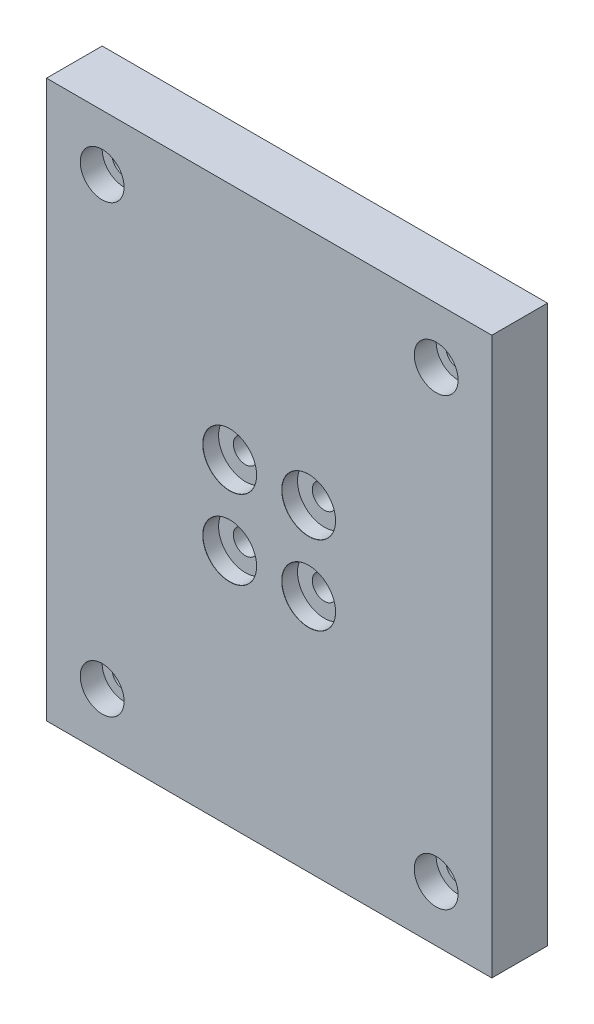
ISO-10303-21;
HEADER;
FILE_DESCRIPTION(('STEP AP214'),'2;1');
FILE_NAME('part.step','',(''),(''),'','','');
FILE_SCHEMA(('AUTOMOTIVE_DESIGN { 1 0 10303 214 1 1 1 1 }'));
ENDSEC;
DATA;
#1=APPLICATION_CONTEXT('core data for automotive mechanical design processes');
#2=APPLICATION_PROTOCOL_DEFINITION('international standard','automotive_design',2000,#1);
#3=PRODUCT_CONTEXT('',#1,'mechanical');
#4=PRODUCT('Part','Part','',(#3));
#5=PRODUCT_RELATED_PRODUCT_CATEGORY('part','',(#4));
#6=PRODUCT_DEFINITION_FORMATION('','',#4);
#7=PRODUCT_DEFINITION_CONTEXT('part definition',#1,'design');
#8=PRODUCT_DEFINITION('design','',#6,#7);
#9=PRODUCT_DEFINITION_SHAPE('','',#8);
#10=(LENGTH_UNIT() NAMED_UNIT(*) SI_UNIT(.MILLI.,.METRE.));
#11=(NAMED_UNIT(*) PLANE_ANGLE_UNIT() SI_UNIT($,.RADIAN.));
#12=(NAMED_UNIT(*) SI_UNIT($,.STERADIAN.) SOLID_ANGLE_UNIT());
#13=UNCERTAINTY_MEASURE_WITH_UNIT(LENGTH_MEASURE(1.E-05),#10,'distance_accuracy_value','');
#14=(GEOMETRIC_REPRESENTATION_CONTEXT(3) GLOBAL_UNCERTAINTY_ASSIGNED_CONTEXT((#13)) GLOBAL_UNIT_ASSIGNED_CONTEXT((#10,
#11,#12)) REPRESENTATION_CONTEXT('',''));
#15=CARTESIAN_POINT('',(0.,0.,0.));
#16=DIRECTION('',(0.,0.,1.));
#17=DIRECTION('',(1.,0.,0.));
#18=AXIS2_PLACEMENT_3D('',#15,#16,#17);
#19=CARTESIAN_POINT('',(0.,0.,12.7));
#20=DIRECTION('',(0.,0.,-1.));
#21=DIRECTION('',(-1.,0.,0.));
#22=AXIS2_PLACEMENT_3D('',#19,#20,#21);
#23=PLANE('',#22);
#24=CARTESIAN_POINT('',(12.7,114.3,12.7));
#25=DIRECTION('',(0.,0.,1.));
#26=DIRECTION('',(1.,0.,0.));
#27=AXIS2_PLACEMENT_3D('',#24,#25,#26);
#28=CIRCLE('',#27,5.);
#29=CARTESIAN_POINT('',(17.7,114.3,12.7));
#30=VERTEX_POINT('',#29);
#31=EDGE_CURVE('E225',#30,#30,#28,.T.);
#32=ORIENTED_EDGE('',*,*,#31,.F.);
#33=EDGE_LOOP('',(#32));
#34=FACE_BOUND('',#33,.T.);
#35=CARTESIAN_POINT('',(88.9,114.3,12.7));
#36=DIRECTION('',(0.,0.,1.));
#37=DIRECTION('',(1.,0.,0.));
#38=AXIS2_PLACEMENT_3D('',#35,#36,#37);
#39=CIRCLE('',#38,5.);
#40=CARTESIAN_POINT('',(93.9,114.3,12.7));
#41=VERTEX_POINT('',#40);
#42=EDGE_CURVE('E213',#41,#41,#39,.T.);
#43=ORIENTED_EDGE('',*,*,#42,.F.);
#44=EDGE_LOOP('',(#43));
#45=FACE_BOUND('',#44,.T.);
#46=CARTESIAN_POINT('',(88.9,12.7,12.7));
#47=DIRECTION('',(0.,0.,1.));
#48=DIRECTION('',(1.,0.,0.));
#49=AXIS2_PLACEMENT_3D('',#46,#47,#48);
#50=CIRCLE('',#49,5.);
#51=CARTESIAN_POINT('',(93.9,12.7,12.7));
#52=VERTEX_POINT('',#51);
#53=EDGE_CURVE('E201',#52,#52,#50,.T.);
#54=ORIENTED_EDGE('',*,*,#53,.F.);
#55=EDGE_LOOP('',(#54));
#56=FACE_BOUND('',#55,.T.);
#57=CARTESIAN_POINT('',(12.7,12.7,12.7));
#58=DIRECTION('',(0.,0.,1.));
#59=DIRECTION('',(1.,0.,0.));
#60=AXIS2_PLACEMENT_3D('',#57,#58,#59);
#61=CIRCLE('',#60,5.);
#62=CARTESIAN_POINT('',(17.7,12.7,12.7));
#63=VERTEX_POINT('',#62);
#64=EDGE_CURVE('E189',#63,#63,#61,.T.);
#65=ORIENTED_EDGE('',*,*,#64,.F.);
#66=EDGE_LOOP('',(#65));
#67=FACE_BOUND('',#66,.T.);
#68=CARTESIAN_POINT('',(41.7957,72.5,12.7));
#69=DIRECTION('',(0.,0.,1.));
#70=DIRECTION('',(1.,0.,0.));
#71=AXIS2_PLACEMENT_3D('',#68,#69,#70);
#72=CIRCLE('',#71,6.145);
#73=CARTESIAN_POINT('',(47.9407,72.5,12.7));
#74=VERTEX_POINT('',#73);
#75=EDGE_CURVE('E177',#74,#74,#72,.T.);
#76=ORIENTED_EDGE('',*,*,#75,.F.);
#77=EDGE_LOOP('',(#76));
#78=FACE_BOUND('',#77,.T.);
#79=CARTESIAN_POINT('',(41.7957,54.5,12.7));
#80=DIRECTION('',(0.,0.,1.));
#81=DIRECTION('',(1.,0.,0.));
#82=AXIS2_PLACEMENT_3D('',#79,#80,#81);
#83=CIRCLE('',#82,6.145);
#84=CARTESIAN_POINT('',(47.9407,54.5,12.7));
#85=VERTEX_POINT('',#84);
#86=EDGE_CURVE('E132',#85,#85,#83,.T.);
#87=ORIENTED_EDGE('',*,*,#86,.F.);
#88=EDGE_LOOP('',(#87));
#89=FACE_BOUND('',#88,.T.);
#90=DIRECTION('',(0.,-1.,0.));
#91=VECTOR('',#90,1.);
#92=CARTESIAN_POINT('',(0.,0.,12.7));
#93=LINE('',#92,#91);
#94=CARTESIAN_POINT('',(0.,127.,12.7));
#95=VERTEX_POINT('',#94);
#96=CARTESIAN_POINT('',(0.,0.,12.7));
#97=VERTEX_POINT('',#96);
#98=EDGE_CURVE('E95',#95,#97,#93,.T.);
#99=ORIENTED_EDGE('',*,*,#98,.T.);
#100=DIRECTION('',(1.,0.,0.));
#101=VECTOR('',#100,1.);
#102=CARTESIAN_POINT('',(0.,0.,12.7));
#103=LINE('',#102,#101);
#104=CARTESIAN_POINT('',(101.6,0.,12.7));
#105=VERTEX_POINT('',#104);
#106=EDGE_CURVE('E90',#97,#105,#103,.T.);
#107=ORIENTED_EDGE('',*,*,#106,.T.);
#108=DIRECTION('',(0.,1.,0.));
#109=VECTOR('',#108,1.);
#110=CARTESIAN_POINT('',(101.6,0.,12.7));
#111=LINE('',#110,#109);
#112=CARTESIAN_POINT('',(101.6,127.,12.7));
#113=VERTEX_POINT('',#112);
#114=EDGE_CURVE('E93',#105,#113,#111,.T.);
#115=ORIENTED_EDGE('',*,*,#114,.T.);
#116=DIRECTION('',(-1.,0.,0.));
#117=VECTOR('',#116,1.);
#118=CARTESIAN_POINT('',(0.,127.,12.7));
#119=LINE('',#118,#117);
#120=EDGE_CURVE('E60',#113,#95,#119,.T.);
#121=ORIENTED_EDGE('',*,*,#120,.T.);
#122=EDGE_LOOP('',(#99,#107,#115,#121));
#123=FACE_BOUND('',#122,.T.);
#124=CARTESIAN_POINT('',(59.8043,54.5,12.7));
#125=DIRECTION('',(0.,0.,1.));
#126=DIRECTION('',(1.,0.,0.));
#127=AXIS2_PLACEMENT_3D('',#124,#125,#126);
#128=CIRCLE('',#127,6.14499999999999);
#129=CARTESIAN_POINT('',(65.9493,54.5,12.7));
#130=VERTEX_POINT('',#129);
#131=EDGE_CURVE('E147',#130,#130,#128,.T.);
#132=ORIENTED_EDGE('',*,*,#131,.F.);
#133=EDGE_LOOP('',(#132));
#134=FACE_BOUND('',#133,.T.);
#135=CARTESIAN_POINT('',(59.8043,72.5,12.7));
#136=DIRECTION('',(0.,0.,1.));
#137=DIRECTION('',(1.,0.,0.));
#138=AXIS2_PLACEMENT_3D('',#135,#136,#137);
#139=CIRCLE('',#138,6.14499999999999);
#140=CARTESIAN_POINT('',(65.9493,72.5,12.7));
#141=VERTEX_POINT('',#140);
#142=EDGE_CURVE('E162',#141,#141,#139,.T.);
#143=ORIENTED_EDGE('',*,*,#142,.F.);
#144=EDGE_LOOP('',(#143));
#145=FACE_BOUND('',#144,.T.);
#146=ADVANCED_FACE('F43',(#34,#45,#56,#67,#78,#89,#123,#134,#145),#23,.F.);
#147=CARTESIAN_POINT('',(0.,0.,12.7));
#148=DIRECTION('',(1.,0.,0.));
#149=DIRECTION('',(0.,0.,-1.));
#150=AXIS2_PLACEMENT_3D('',#147,#148,#149);
#151=PLANE('',#150);
#152=DIRECTION('',(0.,-1.,0.));
#153=VECTOR('',#152,1.);
#154=CARTESIAN_POINT('',(0.,0.,0.));
#155=LINE('',#154,#153);
#156=CARTESIAN_POINT('',(0.,127.,0.));
#157=VERTEX_POINT('',#156);
#158=CARTESIAN_POINT('',(0.,0.,0.));
#159=VERTEX_POINT('',#158);
#160=EDGE_CURVE('E107',#157,#159,#155,.T.);
#161=ORIENTED_EDGE('',*,*,#160,.T.);
#162=DIRECTION('',(0.,0.,-1.));
#163=VECTOR('',#162,1.);
#164=CARTESIAN_POINT('',(0.,0.,12.7));
#165=LINE('',#164,#163);
#166=EDGE_CURVE('E11',#97,#159,#165,.T.);
#167=ORIENTED_EDGE('',*,*,#166,.F.);
#168=ORIENTED_EDGE('',*,*,#98,.F.);
#169=DIRECTION('',(0.,0.,-1.));
#170=VECTOR('',#169,1.);
#171=CARTESIAN_POINT('',(0.,127.,12.7));
#172=LINE('',#171,#170);
#173=EDGE_CURVE('E103',#95,#157,#172,.T.);
#174=ORIENTED_EDGE('',*,*,#173,.T.);
#175=EDGE_LOOP('',(#161,#167,#168,#174));
#176=FACE_BOUND('',#175,.T.);
#177=ADVANCED_FACE('F45',(#176),#151,.F.);
#178=CARTESIAN_POINT('',(0.,0.,12.7));
#179=DIRECTION('',(0.,1.,0.));
#180=DIRECTION('',(0.,0.,1.));
#181=AXIS2_PLACEMENT_3D('',#178,#179,#180);
#182=PLANE('',#181);
#183=DIRECTION('',(1.,0.,0.));
#184=VECTOR('',#183,1.);
#185=CARTESIAN_POINT('',(0.,0.,0.));
#186=LINE('',#185,#184);
#187=CARTESIAN_POINT('',(101.6,0.,0.));
#188=VERTEX_POINT('',#187);
#189=EDGE_CURVE('E99',#159,#188,#186,.T.);
#190=ORIENTED_EDGE('',*,*,#189,.T.);
#191=DIRECTION('',(0.,0.,-1.));
#192=VECTOR('',#191,1.);
#193=CARTESIAN_POINT('',(101.6,0.,12.7));
#194=LINE('',#193,#192);
#195=EDGE_CURVE('E52',#105,#188,#194,.T.);
#196=ORIENTED_EDGE('',*,*,#195,.F.);
#197=ORIENTED_EDGE('',*,*,#106,.F.);
#198=ORIENTED_EDGE('',*,*,#166,.T.);
#199=EDGE_LOOP('',(#190,#196,#197,#198));
#200=FACE_BOUND('',#199,.T.);
#201=ADVANCED_FACE('F98',(#200),#182,.F.);
#202=CARTESIAN_POINT('',(101.6,0.,12.7));
#203=DIRECTION('',(-1.,0.,0.));
#204=DIRECTION('',(0.,0.,1.));
#205=AXIS2_PLACEMENT_3D('',#202,#203,#204);
#206=PLANE('',#205);
#207=DIRECTION('',(0.,1.,0.));
#208=VECTOR('',#207,1.);
#209=CARTESIAN_POINT('',(101.6,0.,0.));
#210=LINE('',#209,#208);
#211=CARTESIAN_POINT('',(101.6,127.,0.));
#212=VERTEX_POINT('',#211);
#213=EDGE_CURVE('E77',#188,#212,#210,.T.);
#214=ORIENTED_EDGE('',*,*,#213,.T.);
#215=DIRECTION('',(0.,0.,-1.));
#216=VECTOR('',#215,1.);
#217=CARTESIAN_POINT('',(101.6,127.,12.7));
#218=LINE('',#217,#216);
#219=EDGE_CURVE('E100',#113,#212,#218,.T.);
#220=ORIENTED_EDGE('',*,*,#219,.F.);
#221=ORIENTED_EDGE('',*,*,#114,.F.);
#222=ORIENTED_EDGE('',*,*,#195,.T.);
#223=EDGE_LOOP('',(#214,#220,#221,#222));
#224=FACE_BOUND('',#223,.T.);
#225=ADVANCED_FACE('F101',(#224),#206,.F.);
#226=CARTESIAN_POINT('',(0.,127.,12.7));
#227=DIRECTION('',(0.,-1.,0.));
#228=DIRECTION('',(0.,0.,-1.));
#229=AXIS2_PLACEMENT_3D('',#226,#227,#228);
#230=PLANE('',#229);
#231=DIRECTION('',(-1.,0.,0.));
#232=VECTOR('',#231,1.);
#233=CARTESIAN_POINT('',(0.,127.,0.));
#234=LINE('',#233,#232);
#235=EDGE_CURVE('E83',#212,#157,#234,.T.);
#236=ORIENTED_EDGE('',*,*,#235,.T.);
#237=ORIENTED_EDGE('',*,*,#173,.F.);
#238=ORIENTED_EDGE('',*,*,#120,.F.);
#239=ORIENTED_EDGE('',*,*,#219,.T.);
#240=EDGE_LOOP('',(#236,#237,#238,#239));
#241=FACE_BOUND('',#240,.T.);
#242=ADVANCED_FACE('F115',(#241),#230,.F.);
#243=CARTESIAN_POINT('',(0.,0.,0.));
#244=DIRECTION('',(0.,0.,-1.));
#245=DIRECTION('',(-1.,0.,0.));
#246=AXIS2_PLACEMENT_3D('',#243,#244,#245);
#247=PLANE('',#246);
#248=CARTESIAN_POINT('',(12.7,114.3,0.));
#249=DIRECTION('',(0.,0.,1.));
#250=DIRECTION('',(1.,0.,0.));
#251=AXIS2_PLACEMENT_3D('',#248,#249,#250);
#252=CIRCLE('',#251,2.75);
#253=CARTESIAN_POINT('',(15.45,114.3,0.));
#254=VERTEX_POINT('',#253);
#255=EDGE_CURVE('E216',#254,#254,#252,.T.);
#256=ORIENTED_EDGE('',*,*,#255,.T.);
#257=EDGE_LOOP('',(#256));
#258=FACE_BOUND('',#257,.T.);
#259=CARTESIAN_POINT('',(88.9,114.3,0.));
#260=DIRECTION('',(0.,0.,1.));
#261=DIRECTION('',(1.,0.,0.));
#262=AXIS2_PLACEMENT_3D('',#259,#260,#261);
#263=CIRCLE('',#262,2.75);
#264=CARTESIAN_POINT('',(91.65,114.3,0.));
#265=VERTEX_POINT('',#264);
#266=EDGE_CURVE('E204',#265,#265,#263,.T.);
#267=ORIENTED_EDGE('',*,*,#266,.T.);
#268=EDGE_LOOP('',(#267));
#269=FACE_BOUND('',#268,.T.);
#270=CARTESIAN_POINT('',(88.9,12.7,0.));
#271=DIRECTION('',(0.,0.,1.));
#272=DIRECTION('',(1.,0.,0.));
#273=AXIS2_PLACEMENT_3D('',#270,#271,#272);
#274=CIRCLE('',#273,2.75);
#275=CARTESIAN_POINT('',(91.65,12.7,0.));
#276=VERTEX_POINT('',#275);
#277=EDGE_CURVE('E192',#276,#276,#274,.T.);
#278=ORIENTED_EDGE('',*,*,#277,.T.);
#279=EDGE_LOOP('',(#278));
#280=FACE_BOUND('',#279,.T.);
#281=CARTESIAN_POINT('',(12.7,12.7,0.));
#282=DIRECTION('',(0.,0.,1.));
#283=DIRECTION('',(1.,0.,0.));
#284=AXIS2_PLACEMENT_3D('',#281,#282,#283);
#285=CIRCLE('',#284,2.75);
#286=CARTESIAN_POINT('',(15.45,12.7,0.));
#287=VERTEX_POINT('',#286);
#288=EDGE_CURVE('E180',#287,#287,#285,.T.);
#289=ORIENTED_EDGE('',*,*,#288,.T.);
#290=EDGE_LOOP('',(#289));
#291=FACE_BOUND('',#290,.T.);
#292=CARTESIAN_POINT('',(41.7957,72.5,0.));
#293=DIRECTION('',(0.,0.,-1.));
#294=DIRECTION('',(-1.,0.,0.));
#295=AXIS2_PLACEMENT_3D('',#292,#293,#294);
#296=CIRCLE('',#295,2.75);
#297=CARTESIAN_POINT('',(39.0457,72.5,0.));
#298=VERTEX_POINT('',#297);
#299=EDGE_CURVE('E165',#298,#298,#296,.T.);
#300=ORIENTED_EDGE('',*,*,#299,.F.);
#301=EDGE_LOOP('',(#300));
#302=FACE_BOUND('',#301,.T.);
#303=CARTESIAN_POINT('',(59.8043,72.5,0.));
#304=DIRECTION('',(0.,0.,-1.));
#305=DIRECTION('',(-1.,0.,0.));
#306=AXIS2_PLACEMENT_3D('',#303,#304,#305);
#307=CIRCLE('',#306,2.75);
#308=CARTESIAN_POINT('',(57.0543,72.5,0.));
#309=VERTEX_POINT('',#308);
#310=EDGE_CURVE('E150',#309,#309,#307,.T.);
#311=ORIENTED_EDGE('',*,*,#310,.F.);
#312=EDGE_LOOP('',(#311));
#313=FACE_BOUND('',#312,.T.);
#314=CARTESIAN_POINT('',(59.8043,54.5,0.));
#315=DIRECTION('',(0.,0.,-1.));
#316=DIRECTION('',(-1.,0.,0.));
#317=AXIS2_PLACEMENT_3D('',#314,#315,#316);
#318=CIRCLE('',#317,2.75);
#319=CARTESIAN_POINT('',(57.0543,54.5,0.));
#320=VERTEX_POINT('',#319);
#321=EDGE_CURVE('E135',#320,#320,#318,.T.);
#322=ORIENTED_EDGE('',*,*,#321,.F.);
#323=EDGE_LOOP('',(#322));
#324=FACE_BOUND('',#323,.T.);
#325=CARTESIAN_POINT('',(41.7957,54.5,0.));
#326=DIRECTION('',(0.,0.,-1.));
#327=DIRECTION('',(-1.,0.,0.));
#328=AXIS2_PLACEMENT_3D('',#325,#326,#327);
#329=CIRCLE('',#328,2.75);
#330=CARTESIAN_POINT('',(39.0457,54.5,0.));
#331=VERTEX_POINT('',#330);
#332=EDGE_CURVE('E110',#331,#331,#329,.T.);
#333=ORIENTED_EDGE('',*,*,#332,.F.);
#334=EDGE_LOOP('',(#333));
#335=FACE_BOUND('',#334,.T.);
#336=ORIENTED_EDGE('',*,*,#160,.F.);
#337=ORIENTED_EDGE('',*,*,#235,.F.);
#338=ORIENTED_EDGE('',*,*,#213,.F.);
#339=ORIENTED_EDGE('',*,*,#189,.F.);
#340=EDGE_LOOP('',(#336,#337,#338,#339));
#341=FACE_BOUND('',#340,.T.);
#342=ADVANCED_FACE('F118',(#258,#269,#280,#291,#302,#313,#324,#335,#341),#247,.T.);
#343=CARTESIAN_POINT('',(41.7957,54.5,12.7));
#344=DIRECTION('',(0.,0.,1.));
#345=DIRECTION('',(1.,0.,0.));
#346=AXIS2_PLACEMENT_3D('',#343,#344,#345);
#347=CYLINDRICAL_SURFACE('',#346,2.75);
#348=CARTESIAN_POINT('',(41.7957,54.5,9.12));
#349=DIRECTION('',(0.,0.,1.));
#350=DIRECTION('',(1.,0.,0.));
#351=AXIS2_PLACEMENT_3D('',#348,#349,#350);
#352=CIRCLE('',#351,2.75);
#353=CARTESIAN_POINT('',(44.5457,54.5,9.12));
#354=VERTEX_POINT('',#353);
#355=EDGE_CURVE('E123',#354,#354,#352,.T.);
#356=ORIENTED_EDGE('',*,*,#355,.T.);
#357=EDGE_LOOP('',(#356));
#358=FACE_BOUND('',#357,.T.);
#359=ORIENTED_EDGE('',*,*,#332,.T.);
#360=EDGE_LOOP('',(#359));
#361=FACE_BOUND('',#360,.T.);
#362=ADVANCED_FACE('F265',(#358,#361),#347,.F.);
#363=CARTESIAN_POINT('',(47.9157,54.5,9.12));
#364=DIRECTION('',(0.,0.,-1.));
#365=DIRECTION('',(-1.,0.,0.));
#366=AXIS2_PLACEMENT_3D('',#363,#364,#365);
#367=PLANE('',#366);
#368=ORIENTED_EDGE('',*,*,#355,.F.);
#369=EDGE_LOOP('',(#368));
#370=FACE_BOUND('',#369,.T.);
#371=CARTESIAN_POINT('',(41.7957,54.5,9.12));
#372=DIRECTION('',(0.,0.,1.));
#373=DIRECTION('',(1.,0.,0.));
#374=AXIS2_PLACEMENT_3D('',#371,#372,#373);
#375=CIRCLE('',#374,6.12);
#376=CARTESIAN_POINT('',(47.9157,54.5,9.12));
#377=VERTEX_POINT('',#376);
#378=EDGE_CURVE('E126',#377,#377,#375,.T.);
#379=ORIENTED_EDGE('',*,*,#378,.T.);
#380=EDGE_LOOP('',(#379));
#381=FACE_BOUND('',#380,.T.);
#382=ADVANCED_FACE('F257',(#370,#381),#367,.F.);
#383=CARTESIAN_POINT('',(41.7957,54.5,12.7));
#384=DIRECTION('',(0.,0.,1.));
#385=DIRECTION('',(1.,0.,0.));
#386=AXIS2_PLACEMENT_3D('',#383,#384,#385);
#387=CYLINDRICAL_SURFACE('',#386,6.12);
#388=ORIENTED_EDGE('',*,*,#378,.F.);
#389=EDGE_LOOP('',(#388));
#390=FACE_BOUND('',#389,.T.);
#391=CARTESIAN_POINT('',(41.7957,54.5,12.675));
#392=DIRECTION('',(0.,0.,1.));
#393=DIRECTION('',(1.,0.,0.));
#394=AXIS2_PLACEMENT_3D('',#391,#392,#393);
#395=CIRCLE('',#394,6.12);
#396=CARTESIAN_POINT('',(47.9157,54.5,12.675));
#397=VERTEX_POINT('',#396);
#398=EDGE_CURVE('E129',#397,#397,#395,.T.);
#399=ORIENTED_EDGE('',*,*,#398,.T.);
#400=EDGE_LOOP('',(#399));
#401=FACE_BOUND('',#400,.T.);
#402=ADVANCED_FACE('F247',(#390,#401),#387,.F.);
#403=CARTESIAN_POINT('',(41.7957,54.5,12.7));
#404=DIRECTION('',(0.,0.,1.));
#405=DIRECTION('',(1.,0.,0.));
#406=AXIS2_PLACEMENT_3D('',#403,#404,#405);
#407=CONICAL_SURFACE('',#406,6.145,0.78539816339731);
#408=ORIENTED_EDGE('',*,*,#398,.F.);
#409=EDGE_LOOP('',(#408));
#410=FACE_BOUND('',#409,.T.);
#411=ORIENTED_EDGE('',*,*,#86,.T.);
#412=EDGE_LOOP('',(#411));
#413=FACE_BOUND('',#412,.T.);
#414=ADVANCED_FACE('F244',(#410,#413),#407,.F.);
#415=CARTESIAN_POINT('',(59.8043,54.5,12.7));
#416=DIRECTION('',(0.,0.,1.));
#417=DIRECTION('',(1.,0.,0.));
#418=AXIS2_PLACEMENT_3D('',#415,#416,#417);
#419=CYLINDRICAL_SURFACE('',#418,2.75);
#420=CARTESIAN_POINT('',(59.8043,54.5,9.12));
#421=DIRECTION('',(0.,0.,1.));
#422=DIRECTION('',(1.,0.,0.));
#423=AXIS2_PLACEMENT_3D('',#420,#421,#422);
#424=CIRCLE('',#423,2.75);
#425=CARTESIAN_POINT('',(62.5543,54.5,9.12));
#426=VERTEX_POINT('',#425);
#427=EDGE_CURVE('E138',#426,#426,#424,.T.);
#428=ORIENTED_EDGE('',*,*,#427,.T.);
#429=EDGE_LOOP('',(#428));
#430=FACE_BOUND('',#429,.T.);
#431=ORIENTED_EDGE('',*,*,#321,.T.);
#432=EDGE_LOOP('',(#431));
#433=FACE_BOUND('',#432,.T.);
#434=ADVANCED_FACE('F246',(#430,#433),#419,.F.);
#435=CARTESIAN_POINT('',(65.9243,54.5,9.12));
#436=DIRECTION('',(0.,0.,-1.));
#437=DIRECTION('',(-1.,0.,0.));
#438=AXIS2_PLACEMENT_3D('',#435,#436,#437);
#439=PLANE('',#438);
#440=ORIENTED_EDGE('',*,*,#427,.F.);
#441=EDGE_LOOP('',(#440));
#442=FACE_BOUND('',#441,.T.);
#443=CARTESIAN_POINT('',(59.8043,54.5,9.12));
#444=DIRECTION('',(0.,0.,1.));
#445=DIRECTION('',(1.,0.,0.));
#446=AXIS2_PLACEMENT_3D('',#443,#444,#445);
#447=CIRCLE('',#446,6.11999999999999);
#448=CARTESIAN_POINT('',(65.9243,54.5,9.12));
#449=VERTEX_POINT('',#448);
#450=EDGE_CURVE('E141',#449,#449,#447,.T.);
#451=ORIENTED_EDGE('',*,*,#450,.T.);
#452=EDGE_LOOP('',(#451));
#453=FACE_BOUND('',#452,.T.);
#454=ADVANCED_FACE('F254',(#442,#453),#439,.F.);
#455=CARTESIAN_POINT('',(59.8043,54.5,12.7));
#456=DIRECTION('',(0.,0.,1.));
#457=DIRECTION('',(1.,0.,0.));
#458=AXIS2_PLACEMENT_3D('',#455,#456,#457);
#459=CYLINDRICAL_SURFACE('',#458,6.11999999999999);
#460=ORIENTED_EDGE('',*,*,#450,.F.);
#461=EDGE_LOOP('',(#460));
#462=FACE_BOUND('',#461,.T.);
#463=CARTESIAN_POINT('',(59.8043,54.5,12.675));
#464=DIRECTION('',(0.,0.,1.));
#465=DIRECTION('',(1.,0.,0.));
#466=AXIS2_PLACEMENT_3D('',#463,#464,#465);
#467=CIRCLE('',#466,6.11999999999999);
#468=CARTESIAN_POINT('',(65.9243,54.5,12.675));
#469=VERTEX_POINT('',#468);
#470=EDGE_CURVE('E144',#469,#469,#467,.T.);
#471=ORIENTED_EDGE('',*,*,#470,.T.);
#472=EDGE_LOOP('',(#471));
#473=FACE_BOUND('',#472,.T.);
#474=ADVANCED_FACE('F530',(#462,#473),#459,.F.);
#475=CARTESIAN_POINT('',(59.8043,54.5,12.7));
#476=DIRECTION('',(0.,0.,1.));
#477=DIRECTION('',(1.,0.,0.));
#478=AXIS2_PLACEMENT_3D('',#475,#476,#477);
#479=CONICAL_SURFACE('',#478,6.14499999999999,0.78539816339731);
#480=ORIENTED_EDGE('',*,*,#470,.F.);
#481=EDGE_LOOP('',(#480));
#482=FACE_BOUND('',#481,.T.);
#483=ORIENTED_EDGE('',*,*,#131,.T.);
#484=EDGE_LOOP('',(#483));
#485=FACE_BOUND('',#484,.T.);
#486=ADVANCED_FACE('F520',(#482,#485),#479,.F.);
#487=CARTESIAN_POINT('',(59.8043,72.5,12.7));
#488=DIRECTION('',(0.,0.,1.));
#489=DIRECTION('',(1.,0.,0.));
#490=AXIS2_PLACEMENT_3D('',#487,#488,#489);
#491=CYLINDRICAL_SURFACE('',#490,2.75);
#492=CARTESIAN_POINT('',(59.8043,72.5,9.12));
#493=DIRECTION('',(0.,0.,1.));
#494=DIRECTION('',(1.,0.,0.));
#495=AXIS2_PLACEMENT_3D('',#492,#493,#494);
#496=CIRCLE('',#495,2.75);
#497=CARTESIAN_POINT('',(62.5543,72.5,9.12));
#498=VERTEX_POINT('',#497);
#499=EDGE_CURVE('E153',#498,#498,#496,.T.);
#500=ORIENTED_EDGE('',*,*,#499,.T.);
#501=EDGE_LOOP('',(#500));
#502=FACE_BOUND('',#501,.T.);
#503=ORIENTED_EDGE('',*,*,#310,.T.);
#504=EDGE_LOOP('',(#503));
#505=FACE_BOUND('',#504,.T.);
#506=ADVANCED_FACE('F510',(#502,#505),#491,.F.);
#507=CARTESIAN_POINT('',(65.9243,72.5,9.12));
#508=DIRECTION('',(0.,0.,-1.));
#509=DIRECTION('',(-1.,0.,0.));
#510=AXIS2_PLACEMENT_3D('',#507,#508,#509);
#511=PLANE('',#510);
#512=ORIENTED_EDGE('',*,*,#499,.F.);
#513=EDGE_LOOP('',(#512));
#514=FACE_BOUND('',#513,.T.);
#515=CARTESIAN_POINT('',(59.8043,72.5,9.12));
#516=DIRECTION('',(0.,0.,1.));
#517=DIRECTION('',(1.,0.,0.));
#518=AXIS2_PLACEMENT_3D('',#515,#516,#517);
#519=CIRCLE('',#518,6.11999999999999);
#520=CARTESIAN_POINT('',(65.9243,72.5,9.12));
#521=VERTEX_POINT('',#520);
#522=EDGE_CURVE('E156',#521,#521,#519,.T.);
#523=ORIENTED_EDGE('',*,*,#522,.T.);
#524=EDGE_LOOP('',(#523));
#525=FACE_BOUND('',#524,.T.);
#526=ADVANCED_FACE('F500',(#514,#525),#511,.F.);
#527=CARTESIAN_POINT('',(59.8043,72.5,12.7));
#528=DIRECTION('',(0.,0.,1.));
#529=DIRECTION('',(1.,0.,0.));
#530=AXIS2_PLACEMENT_3D('',#527,#528,#529);
#531=CYLINDRICAL_SURFACE('',#530,6.11999999999999);
#532=ORIENTED_EDGE('',*,*,#522,.F.);
#533=EDGE_LOOP('',(#532));
#534=FACE_BOUND('',#533,.T.);
#535=CARTESIAN_POINT('',(59.8043,72.5,12.675));
#536=DIRECTION('',(0.,0.,1.));
#537=DIRECTION('',(1.,0.,0.));
#538=AXIS2_PLACEMENT_3D('',#535,#536,#537);
#539=CIRCLE('',#538,6.11999999999999);
#540=CARTESIAN_POINT('',(65.9243,72.5,12.675));
#541=VERTEX_POINT('',#540);
#542=EDGE_CURVE('E159',#541,#541,#539,.T.);
#543=ORIENTED_EDGE('',*,*,#542,.T.);
#544=EDGE_LOOP('',(#543));
#545=FACE_BOUND('',#544,.T.);
#546=ADVANCED_FACE('F490',(#534,#545),#531,.F.);
#547=CARTESIAN_POINT('',(59.8043,72.5,12.7));
#548=DIRECTION('',(0.,0.,1.));
#549=DIRECTION('',(1.,0.,0.));
#550=AXIS2_PLACEMENT_3D('',#547,#548,#549);
#551=CONICAL_SURFACE('',#550,6.14499999999999,0.78539816339731);
#552=ORIENTED_EDGE('',*,*,#542,.F.);
#553=EDGE_LOOP('',(#552));
#554=FACE_BOUND('',#553,.T.);
#555=ORIENTED_EDGE('',*,*,#142,.T.);
#556=EDGE_LOOP('',(#555));
#557=FACE_BOUND('',#556,.T.);
#558=ADVANCED_FACE('F480',(#554,#557),#551,.F.);
#559=CARTESIAN_POINT('',(41.7957,72.5,12.7));
#560=DIRECTION('',(0.,0.,1.));
#561=DIRECTION('',(1.,0.,0.));
#562=AXIS2_PLACEMENT_3D('',#559,#560,#561);
#563=CYLINDRICAL_SURFACE('',#562,2.75);
#564=CARTESIAN_POINT('',(41.7957,72.5,9.12));
#565=DIRECTION('',(0.,0.,1.));
#566=DIRECTION('',(1.,0.,0.));
#567=AXIS2_PLACEMENT_3D('',#564,#565,#566);
#568=CIRCLE('',#567,2.75);
#569=CARTESIAN_POINT('',(44.5457,72.5,9.12));
#570=VERTEX_POINT('',#569);
#571=EDGE_CURVE('E168',#570,#570,#568,.T.);
#572=ORIENTED_EDGE('',*,*,#571,.T.);
#573=EDGE_LOOP('',(#572));
#574=FACE_BOUND('',#573,.T.);
#575=ORIENTED_EDGE('',*,*,#299,.T.);
#576=EDGE_LOOP('',(#575));
#577=FACE_BOUND('',#576,.T.);
#578=ADVANCED_FACE('F470',(#574,#577),#563,.F.);
#579=CARTESIAN_POINT('',(47.9157,72.5,9.12));
#580=DIRECTION('',(0.,0.,-1.));
#581=DIRECTION('',(-1.,0.,0.));
#582=AXIS2_PLACEMENT_3D('',#579,#580,#581);
#583=PLANE('',#582);
#584=ORIENTED_EDGE('',*,*,#571,.F.);
#585=EDGE_LOOP('',(#584));
#586=FACE_BOUND('',#585,.T.);
#587=CARTESIAN_POINT('',(41.7957,72.5,9.12));
#588=DIRECTION('',(0.,0.,1.));
#589=DIRECTION('',(1.,0.,0.));
#590=AXIS2_PLACEMENT_3D('',#587,#588,#589);
#591=CIRCLE('',#590,6.12);
#592=CARTESIAN_POINT('',(47.9157,72.5,9.12));
#593=VERTEX_POINT('',#592);
#594=EDGE_CURVE('E171',#593,#593,#591,.T.);
#595=ORIENTED_EDGE('',*,*,#594,.T.);
#596=EDGE_LOOP('',(#595));
#597=FACE_BOUND('',#596,.T.);
#598=ADVANCED_FACE('F461',(#586,#597),#583,.F.);
#599=CARTESIAN_POINT('',(41.7957,72.5,12.7));
#600=DIRECTION('',(0.,0.,1.));
#601=DIRECTION('',(1.,0.,0.));
#602=AXIS2_PLACEMENT_3D('',#599,#600,#601);
#603=CYLINDRICAL_SURFACE('',#602,6.12);
#604=ORIENTED_EDGE('',*,*,#594,.F.);
#605=EDGE_LOOP('',(#604));
#606=FACE_BOUND('',#605,.T.);
#607=CARTESIAN_POINT('',(41.7957,72.5,12.675));
#608=DIRECTION('',(0.,0.,1.));
#609=DIRECTION('',(1.,0.,0.));
#610=AXIS2_PLACEMENT_3D('',#607,#608,#609);
#611=CIRCLE('',#610,6.12);
#612=CARTESIAN_POINT('',(47.9157,72.5,12.675));
#613=VERTEX_POINT('',#612);
#614=EDGE_CURVE('E174',#613,#613,#611,.T.);
#615=ORIENTED_EDGE('',*,*,#614,.T.);
#616=EDGE_LOOP('',(#615));
#617=FACE_BOUND('',#616,.T.);
#618=ADVANCED_FACE('F452',(#606,#617),#603,.F.);
#619=CARTESIAN_POINT('',(41.7957,72.5,12.7));
#620=DIRECTION('',(0.,0.,1.));
#621=DIRECTION('',(1.,0.,0.));
#622=AXIS2_PLACEMENT_3D('',#619,#620,#621);
#623=CONICAL_SURFACE('',#622,6.145,0.78539816339731);
#624=ORIENTED_EDGE('',*,*,#614,.F.);
#625=EDGE_LOOP('',(#624));
#626=FACE_BOUND('',#625,.T.);
#627=ORIENTED_EDGE('',*,*,#75,.T.);
#628=EDGE_LOOP('',(#627));
#629=FACE_BOUND('',#628,.T.);
#630=ADVANCED_FACE('F295',(#626,#629),#623,.F.);
#631=CARTESIAN_POINT('',(12.7,12.7,12.7));
#632=DIRECTION('',(0.,0.,1.));
#633=DIRECTION('',(1.,0.,0.));
#634=AXIS2_PLACEMENT_3D('',#631,#632,#633);
#635=CYLINDRICAL_SURFACE('',#634,2.75);
#636=ORIENTED_EDGE('',*,*,#288,.F.);
#637=EDGE_LOOP('',(#636));
#638=FACE_BOUND('',#637,.T.);
#639=CARTESIAN_POINT('',(12.7,12.7,7.7));
#640=DIRECTION('',(0.,0.,1.));
#641=DIRECTION('',(1.,0.,0.));
#642=AXIS2_PLACEMENT_3D('',#639,#640,#641);
#643=CIRCLE('',#642,2.75);
#644=CARTESIAN_POINT('',(15.45,12.7,7.7));
#645=VERTEX_POINT('',#644);
#646=EDGE_CURVE('E183',#645,#645,#643,.T.);
#647=ORIENTED_EDGE('',*,*,#646,.T.);
#648=EDGE_LOOP('',(#647));
#649=FACE_BOUND('',#648,.T.);
#650=ADVANCED_FACE('F307',(#638,#649),#635,.F.);
#651=CARTESIAN_POINT('',(15.45,12.7,7.7));
#652=DIRECTION('',(0.,0.,-1.));
#653=DIRECTION('',(-1.,0.,0.));
#654=AXIS2_PLACEMENT_3D('',#651,#652,#653);
#655=PLANE('',#654);
#656=ORIENTED_EDGE('',*,*,#646,.F.);
#657=EDGE_LOOP('',(#656));
#658=FACE_BOUND('',#657,.T.);
#659=CARTESIAN_POINT('',(12.7,12.7,7.7));
#660=DIRECTION('',(0.,0.,1.));
#661=DIRECTION('',(1.,0.,0.));
#662=AXIS2_PLACEMENT_3D('',#659,#660,#661);
#663=CIRCLE('',#662,5.);
#664=CARTESIAN_POINT('',(17.7,12.7,7.7));
#665=VERTEX_POINT('',#664);
#666=EDGE_CURVE('E186',#665,#665,#663,.T.);
#667=ORIENTED_EDGE('',*,*,#666,.T.);
#668=EDGE_LOOP('',(#667));
#669=FACE_BOUND('',#668,.T.);
#670=ADVANCED_FACE('F312',(#658,#669),#655,.F.);
#671=CARTESIAN_POINT('',(12.7,12.7,12.7));
#672=DIRECTION('',(0.,0.,1.));
#673=DIRECTION('',(1.,0.,0.));
#674=AXIS2_PLACEMENT_3D('',#671,#672,#673);
#675=CYLINDRICAL_SURFACE('',#674,5.);
#676=ORIENTED_EDGE('',*,*,#666,.F.);
#677=EDGE_LOOP('',(#676));
#678=FACE_BOUND('',#677,.T.);
#679=ORIENTED_EDGE('',*,*,#64,.T.);
#680=EDGE_LOOP('',(#679));
#681=FACE_BOUND('',#680,.T.);
#682=ADVANCED_FACE('F323',(#678,#681),#675,.F.);
#683=CARTESIAN_POINT('',(88.9,12.7,12.7));
#684=DIRECTION('',(0.,0.,1.));
#685=DIRECTION('',(1.,0.,0.));
#686=AXIS2_PLACEMENT_3D('',#683,#684,#685);
#687=CYLINDRICAL_SURFACE('',#686,2.75);
#688=ORIENTED_EDGE('',*,*,#277,.F.);
#689=EDGE_LOOP('',(#688));
#690=FACE_BOUND('',#689,.T.);
#691=CARTESIAN_POINT('',(88.9,12.7,7.7));
#692=DIRECTION('',(0.,0.,1.));
#693=DIRECTION('',(1.,0.,0.));
#694=AXIS2_PLACEMENT_3D('',#691,#692,#693);
#695=CIRCLE('',#694,2.75);
#696=CARTESIAN_POINT('',(91.65,12.7,7.7));
#697=VERTEX_POINT('',#696);
#698=EDGE_CURVE('E195',#697,#697,#695,.T.);
#699=ORIENTED_EDGE('',*,*,#698,.T.);
#700=EDGE_LOOP('',(#699));
#701=FACE_BOUND('',#700,.T.);
#702=ADVANCED_FACE('F334',(#690,#701),#687,.F.);
#703=CARTESIAN_POINT('',(91.65,12.7,7.7));
#704=DIRECTION('',(0.,0.,-1.));
#705=DIRECTION('',(-1.,0.,0.));
#706=AXIS2_PLACEMENT_3D('',#703,#704,#705);
#707=PLANE('',#706);
#708=ORIENTED_EDGE('',*,*,#698,.F.);
#709=EDGE_LOOP('',(#708));
#710=FACE_BOUND('',#709,.T.);
#711=CARTESIAN_POINT('',(88.9,12.7,7.7));
#712=DIRECTION('',(0.,0.,1.));
#713=DIRECTION('',(1.,0.,0.));
#714=AXIS2_PLACEMENT_3D('',#711,#712,#713);
#715=CIRCLE('',#714,5.);
#716=CARTESIAN_POINT('',(93.9,12.7,7.7));
#717=VERTEX_POINT('',#716);
#718=EDGE_CURVE('E198',#717,#717,#715,.T.);
#719=ORIENTED_EDGE('',*,*,#718,.T.);
#720=EDGE_LOOP('',(#719));
#721=FACE_BOUND('',#720,.T.);
#722=ADVANCED_FACE('F345',(#710,#721),#707,.F.);
#723=CARTESIAN_POINT('',(88.9,12.7,12.7));
#724=DIRECTION('',(0.,0.,1.));
#725=DIRECTION('',(1.,0.,0.));
#726=AXIS2_PLACEMENT_3D('',#723,#724,#725);
#727=CYLINDRICAL_SURFACE('',#726,5.);
#728=ORIENTED_EDGE('',*,*,#718,.F.);
#729=EDGE_LOOP('',(#728));
#730=FACE_BOUND('',#729,.T.);
#731=ORIENTED_EDGE('',*,*,#53,.T.);
#732=EDGE_LOOP('',(#731));
#733=FACE_BOUND('',#732,.T.);
#734=ADVANCED_FACE('F356',(#730,#733),#727,.F.);
#735=CARTESIAN_POINT('',(88.9,114.3,12.7));
#736=DIRECTION('',(0.,0.,1.));
#737=DIRECTION('',(1.,0.,0.));
#738=AXIS2_PLACEMENT_3D('',#735,#736,#737);
#739=CYLINDRICAL_SURFACE('',#738,2.75);
#740=ORIENTED_EDGE('',*,*,#266,.F.);
#741=EDGE_LOOP('',(#740));
#742=FACE_BOUND('',#741,.T.);
#743=CARTESIAN_POINT('',(88.9,114.3,7.7));
#744=DIRECTION('',(0.,0.,1.));
#745=DIRECTION('',(1.,0.,0.));
#746=AXIS2_PLACEMENT_3D('',#743,#744,#745);
#747=CIRCLE('',#746,2.75);
#748=CARTESIAN_POINT('',(91.65,114.3,7.7));
#749=VERTEX_POINT('',#748);
#750=EDGE_CURVE('E207',#749,#749,#747,.T.);
#751=ORIENTED_EDGE('',*,*,#750,.T.);
#752=EDGE_LOOP('',(#751));
#753=FACE_BOUND('',#752,.T.);
#754=ADVANCED_FACE('F367',(#742,#753),#739,.F.);
#755=CARTESIAN_POINT('',(91.65,114.3,7.7));
#756=DIRECTION('',(0.,0.,-1.));
#757=DIRECTION('',(-1.,0.,0.));
#758=AXIS2_PLACEMENT_3D('',#755,#756,#757);
#759=PLANE('',#758);
#760=ORIENTED_EDGE('',*,*,#750,.F.);
#761=EDGE_LOOP('',(#760));
#762=FACE_BOUND('',#761,.T.);
#763=CARTESIAN_POINT('',(88.9,114.3,7.7));
#764=DIRECTION('',(0.,0.,1.));
#765=DIRECTION('',(1.,0.,0.));
#766=AXIS2_PLACEMENT_3D('',#763,#764,#765);
#767=CIRCLE('',#766,5.);
#768=CARTESIAN_POINT('',(93.9,114.3,7.7));
#769=VERTEX_POINT('',#768);
#770=EDGE_CURVE('E210',#769,#769,#767,.T.);
#771=ORIENTED_EDGE('',*,*,#770,.T.);
#772=EDGE_LOOP('',(#771));
#773=FACE_BOUND('',#772,.T.);
#774=ADVANCED_FACE('F378',(#762,#773),#759,.F.);
#775=CARTESIAN_POINT('',(88.9,114.3,12.7));
#776=DIRECTION('',(0.,0.,1.));
#777=DIRECTION('',(1.,0.,0.));
#778=AXIS2_PLACEMENT_3D('',#775,#776,#777);
#779=CYLINDRICAL_SURFACE('',#778,5.);
#780=ORIENTED_EDGE('',*,*,#770,.F.);
#781=EDGE_LOOP('',(#780));
#782=FACE_BOUND('',#781,.T.);
#783=ORIENTED_EDGE('',*,*,#42,.T.);
#784=EDGE_LOOP('',(#783));
#785=FACE_BOUND('',#784,.T.);
#786=ADVANCED_FACE('F389',(#782,#785),#779,.F.);
#787=CARTESIAN_POINT('',(12.7,114.3,12.7));
#788=DIRECTION('',(0.,0.,1.));
#789=DIRECTION('',(1.,0.,0.));
#790=AXIS2_PLACEMENT_3D('',#787,#788,#789);
#791=CYLINDRICAL_SURFACE('',#790,2.75);
#792=ORIENTED_EDGE('',*,*,#255,.F.);
#793=EDGE_LOOP('',(#792));
#794=FACE_BOUND('',#793,.T.);
#795=CARTESIAN_POINT('',(12.7,114.3,7.7));
#796=DIRECTION('',(0.,0.,1.));
#797=DIRECTION('',(1.,0.,0.));
#798=AXIS2_PLACEMENT_3D('',#795,#796,#797);
#799=CIRCLE('',#798,2.75);
#800=CARTESIAN_POINT('',(15.45,114.3,7.7));
#801=VERTEX_POINT('',#800);
#802=EDGE_CURVE('E219',#801,#801,#799,.T.);
#803=ORIENTED_EDGE('',*,*,#802,.T.);
#804=EDGE_LOOP('',(#803));
#805=FACE_BOUND('',#804,.T.);
#806=ADVANCED_FACE('F400',(#794,#805),#791,.F.);
#807=CARTESIAN_POINT('',(15.45,114.3,7.7));
#808=DIRECTION('',(0.,0.,-1.));
#809=DIRECTION('',(-1.,0.,0.));
#810=AXIS2_PLACEMENT_3D('',#807,#808,#809);
#811=PLANE('',#810);
#812=ORIENTED_EDGE('',*,*,#802,.F.);
#813=EDGE_LOOP('',(#812));
#814=FACE_BOUND('',#813,.T.);
#815=CARTESIAN_POINT('',(12.7,114.3,7.7));
#816=DIRECTION('',(0.,0.,1.));
#817=DIRECTION('',(1.,0.,0.));
#818=AXIS2_PLACEMENT_3D('',#815,#816,#817);
#819=CIRCLE('',#818,5.);
#820=CARTESIAN_POINT('',(17.7,114.3,7.7));
#821=VERTEX_POINT('',#820);
#822=EDGE_CURVE('E222',#821,#821,#819,.T.);
#823=ORIENTED_EDGE('',*,*,#822,.T.);
#824=EDGE_LOOP('',(#823));
#825=FACE_BOUND('',#824,.T.);
#826=ADVANCED_FACE('F411',(#814,#825),#811,.F.);
#827=CARTESIAN_POINT('',(12.7,114.3,12.7));
#828=DIRECTION('',(0.,0.,1.));
#829=DIRECTION('',(1.,0.,0.));
#830=AXIS2_PLACEMENT_3D('',#827,#828,#829);
#831=CYLINDRICAL_SURFACE('',#830,5.);
#832=ORIENTED_EDGE('',*,*,#822,.F.);
#833=EDGE_LOOP('',(#832));
#834=FACE_BOUND('',#833,.T.);
#835=ORIENTED_EDGE('',*,*,#31,.T.);
#836=EDGE_LOOP('',(#835));
#837=FACE_BOUND('',#836,.T.);
#838=ADVANCED_FACE('F229',(#834,#837),#831,.F.);
#839=CLOSED_SHELL('',(#146,#177,#201,#225,#242,#342,#362,#382,#402,#414,#434,#454,#474,#486,
#506,#526,#546,#558,#578,#598,#618,#630,#650,#670,#682,#702,#722,#734,#754,#774,#786,#806,#826,#838));
#840=MANIFOLD_SOLID_BREP('B2',#839);
#841=ADVANCED_BREP_SHAPE_REPRESENTATION('',(#18,#840),#14);
#842=SHAPE_DEFINITION_REPRESENTATION(#9,#841);
ENDSEC;
END-ISO-10303-21;
